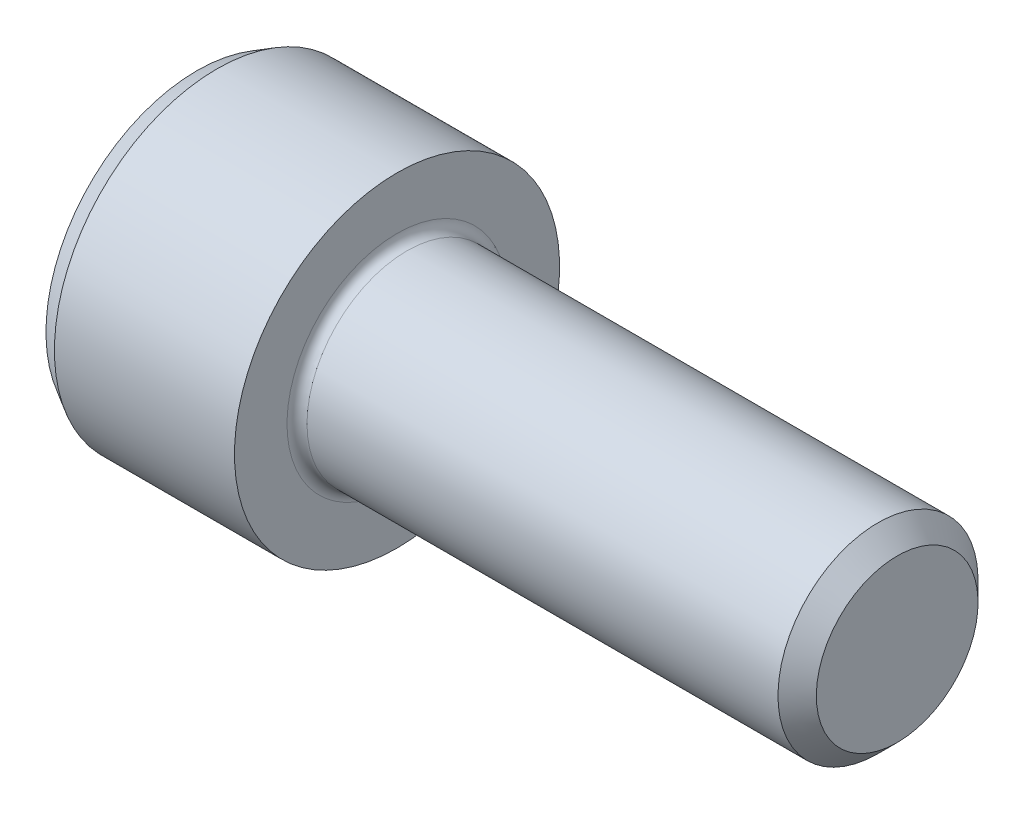
ISO-10303-21;
HEADER;
FILE_DESCRIPTION(('STEP AP214'),'2;1');
FILE_NAME('part.step','',(''),(''),'','','');
FILE_SCHEMA(('AUTOMOTIVE_DESIGN { 1 0 10303 214 1 1 1 1 }'));
ENDSEC;
DATA;
#1=APPLICATION_CONTEXT('core data for automotive mechanical design processes');
#2=APPLICATION_PROTOCOL_DEFINITION('international standard','automotive_design',2000,#1);
#3=PRODUCT_CONTEXT('',#1,'mechanical');
#4=PRODUCT('Part','Part','',(#3));
#5=PRODUCT_RELATED_PRODUCT_CATEGORY('part','',(#4));
#6=PRODUCT_DEFINITION_FORMATION('','',#4);
#7=PRODUCT_DEFINITION_CONTEXT('part definition',#1,'design');
#8=PRODUCT_DEFINITION('design','',#6,#7);
#9=PRODUCT_DEFINITION_SHAPE('','',#8);
#10=(LENGTH_UNIT() NAMED_UNIT(*) SI_UNIT(.MILLI.,.METRE.));
#11=(NAMED_UNIT(*) PLANE_ANGLE_UNIT() SI_UNIT($,.RADIAN.));
#12=(NAMED_UNIT(*) SI_UNIT($,.STERADIAN.) SOLID_ANGLE_UNIT());
#13=UNCERTAINTY_MEASURE_WITH_UNIT(LENGTH_MEASURE(1.E-05),#10,'distance_accuracy_value','');
#14=(GEOMETRIC_REPRESENTATION_CONTEXT(3) GLOBAL_UNCERTAINTY_ASSIGNED_CONTEXT((#13)) GLOBAL_UNIT_ASSIGNED_CONTEXT((#10,
#11,#12)) REPRESENTATION_CONTEXT('',''));
#15=CARTESIAN_POINT('',(0.,0.,0.));
#16=DIRECTION('',(0.,0.,1.));
#17=DIRECTION('',(1.,0.,0.));
#18=AXIS2_PLACEMENT_3D('',#15,#16,#17);
#19=CARTESIAN_POINT('',(-4.,0.,0.));
#20=DIRECTION('',(1.,0.,0.));
#21=DIRECTION('',(0.,0.,-1.));
#22=AXIS2_PLACEMENT_3D('',#19,#20,#21);
#23=PLANE('',#22);
#24=DIRECTION('',(0.,-0.500000000000001,-0.866025403784438));
#25=VECTOR('',#24,1.);
#26=CARTESIAN_POINT('',(-4.,-1.73205080756888,3.));
#27=LINE('',#26,#25);
#28=CARTESIAN_POINT('',(-4.,-1.73205080756888,3.));
#29=VERTEX_POINT('',#28);
#30=CARTESIAN_POINT('',(-4.00000000000193,-2.5980762113226,1.49999999998226));
#31=VERTEX_POINT('',#30);
#32=EDGE_CURVE('E92',#29,#31,#27,.T.);
#33=ORIENTED_EDGE('',*,*,#32,.F.);
#34=DIRECTION('',(0.,1.,0.));
#35=VECTOR('',#34,1.);
#36=CARTESIAN_POINT('',(-4.,0.,3.));
#37=LINE('',#36,#35);
#38=CARTESIAN_POINT('',(-4.00000000000193,0.,2.99999999996453));
#39=VERTEX_POINT('',#38);
#40=EDGE_CURVE('E88',#39,#29,#37,.F.);
#41=ORIENTED_EDGE('',*,*,#40,.F.);
#42=CARTESIAN_POINT('',(-4.00000000000387,0.,0.));
#43=DIRECTION('',(-1.,0.,0.));
#44=DIRECTION('',(0.,0.,1.));
#45=AXIS2_PLACEMENT_3D('',#42,#43,#44);
#46=CIRCLE('',#45,2.99999999992906);
#47=EDGE_CURVE('E19',#39,#31,#46,.F.);
#48=ORIENTED_EDGE('',*,*,#47,.T.);
#49=EDGE_LOOP('',(#33,#41,#48));
#50=FACE_BOUND('',#49,.T.);
#51=ADVANCED_FACE('F16',(#50),#23,.F.);
#52=CARTESIAN_POINT('',(-4.,0.,0.));
#53=DIRECTION('',(1.,0.,0.));
#54=DIRECTION('',(0.,0.,-1.));
#55=AXIS2_PLACEMENT_3D('',#52,#53,#54);
#56=PLANE('',#55);
#57=DIRECTION('',(0.,0.499999999999996,-0.866025403784441));
#58=VECTOR('',#57,1.);
#59=CARTESIAN_POINT('',(-4.,-3.46410161513775,0.));
#60=LINE('',#59,#58);
#61=CARTESIAN_POINT('',(-4.,-3.46410161513775,0.));
#62=VERTEX_POINT('',#61);
#63=CARTESIAN_POINT('',(-4.00000000000193,-2.5980762113226,-1.49999999998226));
#64=VERTEX_POINT('',#63);
#65=EDGE_CURVE('E150',#62,#64,#60,.T.);
#66=ORIENTED_EDGE('',*,*,#65,.F.);
#67=DIRECTION('',(0.,-0.499999999999996,-0.866025403784441));
#68=VECTOR('',#67,1.);
#69=CARTESIAN_POINT('',(-4.,-2.59807621135332,1.5));
#70=LINE('',#69,#68);
#71=EDGE_CURVE('E154',#31,#62,#70,.T.);
#72=ORIENTED_EDGE('',*,*,#71,.F.);
#73=CARTESIAN_POINT('',(-4.00000000000387,0.,0.));
#74=DIRECTION('',(-1.,0.,0.));
#75=DIRECTION('',(0.,0.,1.));
#76=AXIS2_PLACEMENT_3D('',#73,#74,#75);
#77=CIRCLE('',#76,2.99999999992906);
#78=EDGE_CURVE('E108',#31,#64,#77,.F.);
#79=ORIENTED_EDGE('',*,*,#78,.T.);
#80=EDGE_LOOP('',(#66,#72,#79));
#81=FACE_BOUND('',#80,.T.);
#82=ADVANCED_FACE('F210',(#81),#56,.F.);
#83=CARTESIAN_POINT('',(-4.,0.,0.));
#84=DIRECTION('',(1.,0.,0.));
#85=DIRECTION('',(0.,0.,-1.));
#86=AXIS2_PLACEMENT_3D('',#83,#84,#85);
#87=PLANE('',#86);
#88=DIRECTION('',(0.,1.,0.));
#89=VECTOR('',#88,1.);
#90=CARTESIAN_POINT('',(-4.,0.,-3.));
#91=LINE('',#90,#89);
#92=CARTESIAN_POINT('',(-4.,-1.73205080756888,-3.));
#93=VERTEX_POINT('',#92);
#94=CARTESIAN_POINT('',(-4.00000000000193,0.,-2.99999999996453));
#95=VERTEX_POINT('',#94);
#96=EDGE_CURVE('E142',#93,#95,#91,.T.);
#97=ORIENTED_EDGE('',*,*,#96,.F.);
#98=DIRECTION('',(0.,0.500000000000001,-0.866025403784438));
#99=VECTOR('',#98,1.);
#100=CARTESIAN_POINT('',(-4.,-2.59807621135332,-1.5));
#101=LINE('',#100,#99);
#102=EDGE_CURVE('E146',#64,#93,#101,.T.);
#103=ORIENTED_EDGE('',*,*,#102,.F.);
#104=CARTESIAN_POINT('',(-4.00000000000387,0.,0.));
#105=DIRECTION('',(-1.,0.,0.));
#106=DIRECTION('',(0.,0.,1.));
#107=AXIS2_PLACEMENT_3D('',#104,#105,#106);
#108=CIRCLE('',#107,2.99999999992906);
#109=EDGE_CURVE('E205',#64,#95,#108,.F.);
#110=ORIENTED_EDGE('',*,*,#109,.T.);
#111=EDGE_LOOP('',(#97,#103,#110));
#112=FACE_BOUND('',#111,.T.);
#113=ADVANCED_FACE('F213',(#112),#87,.F.);
#114=CARTESIAN_POINT('',(-4.,0.,0.));
#115=DIRECTION('',(1.,0.,0.));
#116=DIRECTION('',(0.,0.,-1.));
#117=AXIS2_PLACEMENT_3D('',#114,#115,#116);
#118=PLANE('',#117);
#119=DIRECTION('',(0.,0.500000000000001,0.866025403784438));
#120=VECTOR('',#119,1.);
#121=CARTESIAN_POINT('',(-4.,1.73205080756888,-3.));
#122=LINE('',#121,#120);
#123=CARTESIAN_POINT('',(-4.,1.73205080756888,-3.));
#124=VERTEX_POINT('',#123);
#125=CARTESIAN_POINT('',(-4.00000000000193,2.5980762113226,-1.49999999998226));
#126=VERTEX_POINT('',#125);
#127=EDGE_CURVE('E134',#124,#126,#122,.T.);
#128=ORIENTED_EDGE('',*,*,#127,.F.);
#129=DIRECTION('',(0.,1.,0.));
#130=VECTOR('',#129,1.);
#131=CARTESIAN_POINT('',(-4.,0.,-3.));
#132=LINE('',#131,#130);
#133=EDGE_CURVE('E138',#95,#124,#132,.T.);
#134=ORIENTED_EDGE('',*,*,#133,.F.);
#135=CARTESIAN_POINT('',(-4.00000000000387,0.,0.));
#136=DIRECTION('',(-1.,0.,0.));
#137=DIRECTION('',(0.,0.,1.));
#138=AXIS2_PLACEMENT_3D('',#135,#136,#137);
#139=CIRCLE('',#138,2.99999999992906);
#140=EDGE_CURVE('E202',#95,#126,#139,.F.);
#141=ORIENTED_EDGE('',*,*,#140,.T.);
#142=EDGE_LOOP('',(#128,#134,#141));
#143=FACE_BOUND('',#142,.T.);
#144=ADVANCED_FACE('F219',(#143),#118,.F.);
#145=CARTESIAN_POINT('',(-4.,0.,0.));
#146=DIRECTION('',(1.,0.,0.));
#147=DIRECTION('',(0.,0.,-1.));
#148=AXIS2_PLACEMENT_3D('',#145,#146,#147);
#149=PLANE('',#148);
#150=CARTESIAN_POINT('',(-4.00000000000387,0.,0.));
#151=DIRECTION('',(-1.,0.,0.));
#152=DIRECTION('',(0.,0.,1.));
#153=AXIS2_PLACEMENT_3D('',#150,#151,#152);
#154=CIRCLE('',#153,2.99999999992906);
#155=CARTESIAN_POINT('',(-4.00000000000193,2.5980762113226,1.49999999998226));
#156=VERTEX_POINT('',#155);
#157=EDGE_CURVE('E116',#126,#156,#154,.F.);
#158=ORIENTED_EDGE('',*,*,#157,.T.);
#159=DIRECTION('',(0.,-0.499999999999996,0.866025403784441));
#160=VECTOR('',#159,1.);
#161=CARTESIAN_POINT('',(-4.,3.46410161513775,0.));
#162=LINE('',#161,#160);
#163=CARTESIAN_POINT('',(-4.,3.46410161513775,0.));
#164=VERTEX_POINT('',#163);
#165=EDGE_CURVE('E130',#164,#156,#162,.T.);
#166=ORIENTED_EDGE('',*,*,#165,.F.);
#167=DIRECTION('',(0.,0.499999999999996,0.866025403784441));
#168=VECTOR('',#167,1.);
#169=CARTESIAN_POINT('',(-4.,2.59807621135332,-1.5));
#170=LINE('',#169,#168);
#171=EDGE_CURVE('E109',#126,#164,#170,.T.);
#172=ORIENTED_EDGE('',*,*,#171,.F.);
#173=EDGE_LOOP('',(#158,#166,#172));
#174=FACE_BOUND('',#173,.T.);
#175=ADVANCED_FACE('F222',(#174),#149,.F.);
#176=CARTESIAN_POINT('',(-3.99999999990541,0.,0.));
#177=DIRECTION('',(-1.,0.,0.));
#178=DIRECTION('',(0.,0.,1.));
#179=AXIS2_PLACEMENT_3D('',#176,#177,#178);
#180=CONICAL_SURFACE('',#179,2.99999999975853,1.04719755110019);
#181=CARTESIAN_POINT('',(-2.26794919240092,0.,-1.13686837721616E-10));
#182=VERTEX_POINT('',#181);
#183=VERTEX_LOOP('',#182);
#184=FACE_BOUND('',#183,.T.);
#185=ORIENTED_EDGE('',*,*,#140,.F.);
#186=ORIENTED_EDGE('',*,*,#109,.F.);
#187=ORIENTED_EDGE('',*,*,#78,.F.);
#188=ORIENTED_EDGE('',*,*,#47,.F.);
#189=CARTESIAN_POINT('',(-4.00000000000387,0.,0.));
#190=DIRECTION('',(-1.,0.,0.));
#191=DIRECTION('',(0.,0.,1.));
#192=AXIS2_PLACEMENT_3D('',#189,#190,#191);
#193=CIRCLE('',#192,2.99999999992906);
#194=EDGE_CURVE('E104',#39,#156,#193,.T.);
#195=ORIENTED_EDGE('',*,*,#194,.T.);
#196=ORIENTED_EDGE('',*,*,#157,.F.);
#197=EDGE_LOOP('',(#185,#186,#187,#188,#195,#196));
#198=FACE_BOUND('',#197,.T.);
#199=ADVANCED_FACE('F102',(#184,#198),#180,.F.);
#200=CARTESIAN_POINT('',(-4.,0.,0.));
#201=DIRECTION('',(1.,0.,0.));
#202=DIRECTION('',(0.,0.,-1.));
#203=AXIS2_PLACEMENT_3D('',#200,#201,#202);
#204=PLANE('',#203);
#205=DIRECTION('',(0.,1.,0.));
#206=VECTOR('',#205,1.);
#207=CARTESIAN_POINT('',(-4.,1.73205080756888,3.));
#208=LINE('',#207,#206);
#209=CARTESIAN_POINT('',(-4.,1.73205080756888,3.));
#210=VERTEX_POINT('',#209);
#211=EDGE_CURVE('E112',#210,#39,#208,.F.);
#212=ORIENTED_EDGE('',*,*,#211,.F.);
#213=DIRECTION('',(0.,0.5,-0.866025403784439));
#214=VECTOR('',#213,1.);
#215=CARTESIAN_POINT('',(-4.,3.46410161513775,0.));
#216=LINE('',#215,#214);
#217=EDGE_CURVE('E115',#156,#210,#216,.F.);
#218=ORIENTED_EDGE('',*,*,#217,.F.);
#219=ORIENTED_EDGE('',*,*,#194,.F.);
#220=EDGE_LOOP('',(#212,#218,#219));
#221=FACE_BOUND('',#220,.T.);
#222=ADVANCED_FACE('F111',(#221),#204,.F.);
#223=CARTESIAN_POINT('',(-4.,1.73205080756888,3.));
#224=DIRECTION('',(0.,0.,-1.));
#225=DIRECTION('',(-1.,0.,0.));
#226=AXIS2_PLACEMENT_3D('',#223,#224,#225);
#227=PLANE('',#226);
#228=ORIENTED_EDGE('',*,*,#40,.T.);
#229=DIRECTION('',(1.,0.,0.));
#230=VECTOR('',#229,1.);
#231=CARTESIAN_POINT('',(-4.,-1.73205080756888,3.));
#232=LINE('',#231,#230);
#233=CARTESIAN_POINT('',(-8.,-1.73205080756888,3.));
#234=VERTEX_POINT('',#233);
#235=EDGE_CURVE('E177',#234,#29,#232,.T.);
#236=ORIENTED_EDGE('',*,*,#235,.F.);
#237=DIRECTION('',(0.,1.,0.));
#238=VECTOR('',#237,1.);
#239=CARTESIAN_POINT('',(-8.,0.,3.));
#240=LINE('',#239,#238);
#241=CARTESIAN_POINT('',(-8.,1.73205080756888,3.));
#242=VERTEX_POINT('',#241);
#243=EDGE_CURVE('E182',#234,#242,#240,.T.);
#244=ORIENTED_EDGE('',*,*,#243,.T.);
#245=DIRECTION('',(1.,0.,0.));
#246=VECTOR('',#245,1.);
#247=CARTESIAN_POINT('',(-4.,1.73205080756887,3.));
#248=LINE('',#247,#246);
#249=EDGE_CURVE('E120',#210,#242,#248,.F.);
#250=ORIENTED_EDGE('',*,*,#249,.F.);
#251=ORIENTED_EDGE('',*,*,#211,.T.);
#252=EDGE_LOOP('',(#228,#236,#244,#250,#251));
#253=FACE_BOUND('',#252,.T.);
#254=ADVANCED_FACE('F118',(#253),#227,.T.);
#255=CARTESIAN_POINT('',(-4.,3.46410161513775,0.));
#256=DIRECTION('',(0.,-0.866025403784439,-0.5));
#257=DIRECTION('',(0.,0.5,-0.866025403784439));
#258=AXIS2_PLACEMENT_3D('',#255,#256,#257);
#259=PLANE('',#258);
#260=ORIENTED_EDGE('',*,*,#217,.T.);
#261=ORIENTED_EDGE('',*,*,#249,.T.);
#262=DIRECTION('',(0.,0.499999999999998,-0.86602540378444));
#263=VECTOR('',#262,1.);
#264=CARTESIAN_POINT('',(-8.,1.73205080756888,3.));
#265=LINE('',#264,#263);
#266=CARTESIAN_POINT('',(-8.,3.46410161513775,0.));
#267=VERTEX_POINT('',#266);
#268=EDGE_CURVE('E231',#242,#267,#265,.T.);
#269=ORIENTED_EDGE('',*,*,#268,.T.);
#270=DIRECTION('',(1.,0.,0.));
#271=VECTOR('',#270,1.);
#272=CARTESIAN_POINT('',(-4.,3.46410161513776,0.));
#273=LINE('',#272,#271);
#274=EDGE_CURVE('E165',#164,#267,#273,.F.);
#275=ORIENTED_EDGE('',*,*,#274,.F.);
#276=ORIENTED_EDGE('',*,*,#165,.T.);
#277=EDGE_LOOP('',(#260,#261,#269,#275,#276));
#278=FACE_BOUND('',#277,.T.);
#279=ADVANCED_FACE('F229',(#278),#259,.T.);
#280=CARTESIAN_POINT('',(-4.,1.73205080756888,-3.));
#281=DIRECTION('',(0.,-0.866025403784439,0.5));
#282=DIRECTION('',(0.,-0.5,-0.866025403784439));
#283=AXIS2_PLACEMENT_3D('',#280,#281,#282);
#284=PLANE('',#283);
#285=ORIENTED_EDGE('',*,*,#171,.T.);
#286=ORIENTED_EDGE('',*,*,#274,.T.);
#287=DIRECTION('',(0.,-0.499999999999998,-0.86602540378444));
#288=VECTOR('',#287,1.);
#289=CARTESIAN_POINT('',(-8.,3.46410161513775,0.));
#290=LINE('',#289,#288);
#291=CARTESIAN_POINT('',(-8.,1.73205080756888,-3.));
#292=VERTEX_POINT('',#291);
#293=EDGE_CURVE('E234',#267,#292,#290,.T.);
#294=ORIENTED_EDGE('',*,*,#293,.T.);
#295=DIRECTION('',(1.,0.,0.));
#296=VECTOR('',#295,1.);
#297=CARTESIAN_POINT('',(-4.,1.73205080756888,-3.));
#298=LINE('',#297,#296);
#299=EDGE_CURVE('E168',#124,#292,#298,.F.);
#300=ORIENTED_EDGE('',*,*,#299,.F.);
#301=ORIENTED_EDGE('',*,*,#127,.T.);
#302=EDGE_LOOP('',(#285,#286,#294,#300,#301));
#303=FACE_BOUND('',#302,.T.);
#304=ADVANCED_FACE('F225',(#303),#284,.T.);
#305=CARTESIAN_POINT('',(-4.,-1.73205080756888,-3.));
#306=DIRECTION('',(0.,0.,1.));
#307=DIRECTION('',(1.,0.,0.));
#308=AXIS2_PLACEMENT_3D('',#305,#306,#307);
#309=PLANE('',#308);
#310=ORIENTED_EDGE('',*,*,#133,.T.);
#311=ORIENTED_EDGE('',*,*,#299,.T.);
#312=DIRECTION('',(0.,1.,0.));
#313=VECTOR('',#312,1.);
#314=CARTESIAN_POINT('',(-8.,0.,-3.));
#315=LINE('',#314,#313);
#316=CARTESIAN_POINT('',(-8.,-1.73205080756888,-3.));
#317=VERTEX_POINT('',#316);
#318=EDGE_CURVE('E236',#292,#317,#315,.F.);
#319=ORIENTED_EDGE('',*,*,#318,.T.);
#320=DIRECTION('',(1.,0.,0.));
#321=VECTOR('',#320,1.);
#322=CARTESIAN_POINT('',(-4.,-1.73205080756887,-3.));
#323=LINE('',#322,#321);
#324=EDGE_CURVE('E173',#93,#317,#323,.F.);
#325=ORIENTED_EDGE('',*,*,#324,.F.);
#326=ORIENTED_EDGE('',*,*,#96,.T.);
#327=EDGE_LOOP('',(#310,#311,#319,#325,#326));
#328=FACE_BOUND('',#327,.T.);
#329=ADVANCED_FACE('F312',(#328),#309,.T.);
#330=CARTESIAN_POINT('',(-4.,-3.46410161513775,0.));
#331=DIRECTION('',(0.,0.866025403784439,0.5));
#332=DIRECTION('',(0.,-0.5,0.866025403784439));
#333=AXIS2_PLACEMENT_3D('',#330,#331,#332);
#334=PLANE('',#333);
#335=ORIENTED_EDGE('',*,*,#102,.T.);
#336=ORIENTED_EDGE('',*,*,#324,.T.);
#337=DIRECTION('',(0.,-0.499999999999998,0.86602540378444));
#338=VECTOR('',#337,1.);
#339=CARTESIAN_POINT('',(-8.,-1.73205080756888,-3.));
#340=LINE('',#339,#338);
#341=CARTESIAN_POINT('',(-8.,-3.46410161513775,0.));
#342=VERTEX_POINT('',#341);
#343=EDGE_CURVE('E34',#317,#342,#340,.T.);
#344=ORIENTED_EDGE('',*,*,#343,.T.);
#345=DIRECTION('',(1.,0.,0.));
#346=VECTOR('',#345,1.);
#347=CARTESIAN_POINT('',(-4.,-3.46410161513776,0.));
#348=LINE('',#347,#346);
#349=EDGE_CURVE('E180',#62,#342,#348,.F.);
#350=ORIENTED_EDGE('',*,*,#349,.F.);
#351=ORIENTED_EDGE('',*,*,#65,.T.);
#352=EDGE_LOOP('',(#335,#336,#344,#350,#351));
#353=FACE_BOUND('',#352,.T.);
#354=ADVANCED_FACE('F308',(#353),#334,.T.);
#355=CARTESIAN_POINT('',(-4.,-1.73205080756888,3.));
#356=DIRECTION('',(0.,0.866025403784439,-0.5));
#357=DIRECTION('',(0.,0.5,0.866025403784439));
#358=AXIS2_PLACEMENT_3D('',#355,#356,#357);
#359=PLANE('',#358);
#360=ORIENTED_EDGE('',*,*,#71,.T.);
#361=ORIENTED_EDGE('',*,*,#349,.T.);
#362=DIRECTION('',(0.,0.499999999999998,0.86602540378444));
#363=VECTOR('',#362,1.);
#364=CARTESIAN_POINT('',(-8.,-3.46410161513775,0.));
#365=LINE('',#364,#363);
#366=EDGE_CURVE('E198',#342,#234,#365,.T.);
#367=ORIENTED_EDGE('',*,*,#366,.T.);
#368=ORIENTED_EDGE('',*,*,#235,.T.);
#369=ORIENTED_EDGE('',*,*,#32,.T.);
#370=EDGE_LOOP('',(#360,#361,#367,#368,#369));
#371=FACE_BOUND('',#370,.T.);
#372=ADVANCED_FACE('F305',(#371),#359,.T.);
#373=CARTESIAN_POINT('',(-8.,0.,0.));
#374=DIRECTION('',(1.,0.,0.));
#375=DIRECTION('',(0.,1.,0.));
#376=AXIS2_PLACEMENT_3D('',#373,#374,#375);
#377=PLANE('',#376);
#378=ORIENTED_EDGE('',*,*,#343,.F.);
#379=ORIENTED_EDGE('',*,*,#318,.F.);
#380=ORIENTED_EDGE('',*,*,#293,.F.);
#381=ORIENTED_EDGE('',*,*,#268,.F.);
#382=ORIENTED_EDGE('',*,*,#243,.F.);
#383=ORIENTED_EDGE('',*,*,#366,.F.);
#384=EDGE_LOOP('',(#378,#379,#380,#381,#382,#383));
#385=FACE_BOUND('',#384,.T.);
#386=CARTESIAN_POINT('',(-7.99999999992451,0.,0.));
#387=DIRECTION('',(1.,0.,0.));
#388=DIRECTION('',(0.,1.,0.));
#389=AXIS2_PLACEMENT_3D('',#386,#387,#388);
#390=CIRCLE('',#389,6.03811978460015);
#391=CARTESIAN_POINT('',(-7.99999999992451,6.03811978460014,0.));
#392=VERTEX_POINT('',#391);
#393=EDGE_CURVE('E196',#392,#392,#390,.T.);
#394=ORIENTED_EDGE('',*,*,#393,.F.);
#395=EDGE_LOOP('',(#394));
#396=FACE_BOUND('',#395,.T.);
#397=ADVANCED_FACE('F301',(#385,#396),#377,.F.);
#398=CARTESIAN_POINT('',(-7.20000000001164,0.,0.));
#399=DIRECTION('',(1.,0.,0.));
#400=DIRECTION('',(0.,1.,0.));
#401=AXIS2_PLACEMENT_3D('',#398,#399,#400);
#402=CONICAL_SURFACE('',#401,6.49999999990315,0.523598775599803);
#403=ORIENTED_EDGE('',*,*,#393,.T.);
#404=EDGE_LOOP('',(#403));
#405=FACE_BOUND('',#404,.T.);
#406=CARTESIAN_POINT('',(-7.20000000000002,0.,0.));
#407=DIRECTION('',(-1.,0.,0.));
#408=DIRECTION('',(0.,-1.,0.));
#409=AXIS2_PLACEMENT_3D('',#406,#407,#408);
#410=CIRCLE('',#409,6.50000000000001);
#411=CARTESIAN_POINT('',(-7.20000000000002,-6.50000000000002,0.));
#412=VERTEX_POINT('',#411);
#413=EDGE_CURVE('E195',#412,#412,#410,.F.);
#414=ORIENTED_EDGE('',*,*,#413,.F.);
#415=EDGE_LOOP('',(#414));
#416=FACE_BOUND('',#415,.T.);
#417=ADVANCED_FACE('F297',(#405,#416),#402,.T.);
#418=CARTESIAN_POINT('',(20.,0.,0.));
#419=DIRECTION('',(-1.,0.,0.));
#420=DIRECTION('',(0.,-1.,0.));
#421=AXIS2_PLACEMENT_3D('',#418,#419,#420);
#422=CYLINDRICAL_SURFACE('',#421,6.50000000000001);
#423=ORIENTED_EDGE('',*,*,#413,.T.);
#424=EDGE_LOOP('',(#423));
#425=FACE_BOUND('',#424,.T.);
#426=CARTESIAN_POINT('',(0.,0.,0.));
#427=DIRECTION('',(-1.,0.,0.));
#428=DIRECTION('',(0.,-1.,0.));
#429=AXIS2_PLACEMENT_3D('',#426,#427,#428);
#430=CIRCLE('',#429,6.50000000000001);
#431=CARTESIAN_POINT('',(0.,-6.50000000000002,0.));
#432=VERTEX_POINT('',#431);
#433=EDGE_CURVE('E192',#432,#432,#430,.T.);
#434=ORIENTED_EDGE('',*,*,#433,.T.);
#435=EDGE_LOOP('',(#434));
#436=FACE_BOUND('',#435,.T.);
#437=ADVANCED_FACE('F293',(#425,#436),#422,.T.);
#438=CARTESIAN_POINT('',(20.,3.23299999999999,0.));
#439=DIRECTION('',(-1.,0.,0.));
#440=DIRECTION('',(0.,-1.,0.));
#441=AXIS2_PLACEMENT_3D('',#438,#439,#440);
#442=PLANE('',#441);
#443=CARTESIAN_POINT('',(20.0000000000387,0.,0.));
#444=DIRECTION('',(-1.,0.,0.));
#445=DIRECTION('',(0.,-1.,0.));
#446=AXIS2_PLACEMENT_3D('',#443,#444,#445);
#447=CIRCLE('',#446,3.23299999996607);
#448=CARTESIAN_POINT('',(20.0000000000387,-3.23299999996607,0.));
#449=VERTEX_POINT('',#448);
#450=EDGE_CURVE('E188',#449,#449,#447,.T.);
#451=ORIENTED_EDGE('',*,*,#450,.F.);
#452=EDGE_LOOP('',(#451));
#453=FACE_BOUND('',#452,.T.);
#454=ADVANCED_FACE('F289',(#453),#442,.F.);
#455=CARTESIAN_POINT('',(0.,6.5,0.));
#456=DIRECTION('',(-1.,0.,0.));
#457=DIRECTION('',(0.,-1.,0.));
#458=AXIS2_PLACEMENT_3D('',#455,#456,#457);
#459=PLANE('',#458);
#460=ORIENTED_EDGE('',*,*,#433,.F.);
#461=EDGE_LOOP('',(#460));
#462=FACE_BOUND('',#461,.T.);
#463=CARTESIAN_POINT('',(0.,0.,0.));
#464=DIRECTION('',(1.,0.,0.));
#465=DIRECTION('',(0.,1.,0.));
#466=AXIS2_PLACEMENT_3D('',#463,#464,#465);
#467=CIRCLE('',#466,4.40000000000001);
#468=CARTESIAN_POINT('',(0.,4.4,0.));
#469=VERTEX_POINT('',#468);
#470=EDGE_CURVE('E191',#469,#469,#467,.F.);
#471=ORIENTED_EDGE('',*,*,#470,.T.);
#472=EDGE_LOOP('',(#471));
#473=FACE_BOUND('',#472,.T.);
#474=ADVANCED_FACE('F280',(#462,#473),#459,.F.);
#475=CARTESIAN_POINT('',(19.2330000000993,0.,0.));
#476=DIRECTION('',(-1.,0.,0.));
#477=DIRECTION('',(0.,-1.,0.));
#478=AXIS2_PLACEMENT_3D('',#475,#476,#477);
#479=CONICAL_SURFACE('',#478,3.99999999990541,0.785398163397448);
#480=CARTESIAN_POINT('',(19.233,0.,0.));
#481=DIRECTION('',(-1.,0.,0.));
#482=DIRECTION('',(0.,-1.,0.));
#483=AXIS2_PLACEMENT_3D('',#480,#481,#482);
#484=CIRCLE('',#483,4.);
#485=CARTESIAN_POINT('',(19.233,-4.,0.));
#486=VERTEX_POINT('',#485);
#487=EDGE_CURVE('E25',#486,#486,#484,.T.);
#488=ORIENTED_EDGE('',*,*,#487,.F.);
#489=EDGE_LOOP('',(#488));
#490=FACE_BOUND('',#489,.T.);
#491=ORIENTED_EDGE('',*,*,#450,.T.);
#492=EDGE_LOOP('',(#491));
#493=FACE_BOUND('',#492,.T.);
#494=ADVANCED_FACE('F268',(#490,#493),#479,.T.);
#495=CARTESIAN_POINT('',(0.400000000000001,0.,0.));
#496=DIRECTION('',(1.,0.,0.));
#497=DIRECTION('',(0.,1.,0.));
#498=AXIS2_PLACEMENT_3D('',#495,#496,#497);
#499=TOROIDAL_SURFACE('',#498,4.40000000000001,0.400000000000001);
#500=ORIENTED_EDGE('',*,*,#470,.F.);
#501=EDGE_LOOP('',(#500));
#502=FACE_BOUND('',#501,.T.);
#503=CARTESIAN_POINT('',(0.400000000000001,0.,0.));
#504=DIRECTION('',(-1.,0.,0.));
#505=DIRECTION('',(0.,-1.,0.));
#506=AXIS2_PLACEMENT_3D('',#503,#504,#505);
#507=CIRCLE('',#506,4.);
#508=CARTESIAN_POINT('',(0.400000000000002,-4.00000000000001,0.));
#509=VERTEX_POINT('',#508);
#510=EDGE_CURVE('E11',#509,#509,#507,.F.);
#511=ORIENTED_EDGE('',*,*,#510,.F.);
#512=EDGE_LOOP('',(#511));
#513=FACE_BOUND('',#512,.T.);
#514=ADVANCED_FACE('F256',(#502,#513),#499,.F.);
#515=CARTESIAN_POINT('',(20.,0.,0.));
#516=DIRECTION('',(-1.,0.,0.));
#517=DIRECTION('',(0.,-1.,0.));
#518=AXIS2_PLACEMENT_3D('',#515,#516,#517);
#519=CYLINDRICAL_SURFACE('',#518,4.);
#520=ORIENTED_EDGE('',*,*,#510,.T.);
#521=EDGE_LOOP('',(#520));
#522=FACE_BOUND('',#521,.T.);
#523=ORIENTED_EDGE('',*,*,#487,.T.);
#524=EDGE_LOOP('',(#523));
#525=FACE_BOUND('',#524,.T.);
#526=ADVANCED_FACE('F267',(#522,#525),#519,.T.);
#527=CLOSED_SHELL('',(#51,#82,#113,#144,#175,#199,#222,#254,#279,#304,#329,#354,#372,#397,#417,
#437,#454,#474,#494,#514,#526));
#528=MANIFOLD_SOLID_BREP('B1',#527);
#529=ADVANCED_BREP_SHAPE_REPRESENTATION('',(#18,#528),#14);
#530=SHAPE_DEFINITION_REPRESENTATION(#9,#529);
ENDSEC;
END-ISO-10303-21;
